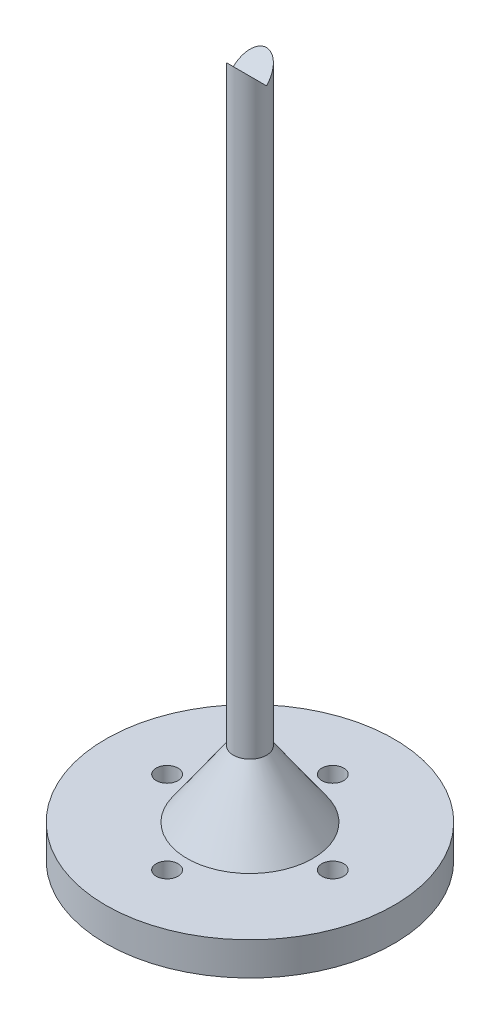
ISO-10303-21;
HEADER;
FILE_DESCRIPTION(('STEP AP214'),'2;1');
FILE_NAME('part.step','',(''),(''),'','','');
FILE_SCHEMA(('AUTOMOTIVE_DESIGN { 1 0 10303 214 1 1 1 1 }'));
ENDSEC;
DATA;
#1=APPLICATION_CONTEXT('core data for automotive mechanical design processes');
#2=APPLICATION_PROTOCOL_DEFINITION('international standard','automotive_design',2000,#1);
#3=PRODUCT_CONTEXT('',#1,'mechanical');
#4=PRODUCT('Part','Part','',(#3));
#5=PRODUCT_RELATED_PRODUCT_CATEGORY('part','',(#4));
#6=PRODUCT_DEFINITION_FORMATION('','',#4);
#7=PRODUCT_DEFINITION_CONTEXT('part definition',#1,'design');
#8=PRODUCT_DEFINITION('design','',#6,#7);
#9=PRODUCT_DEFINITION_SHAPE('','',#8);
#10=(LENGTH_UNIT() NAMED_UNIT(*) SI_UNIT(.MILLI.,.METRE.));
#11=(NAMED_UNIT(*) PLANE_ANGLE_UNIT() SI_UNIT($,.RADIAN.));
#12=(NAMED_UNIT(*) SI_UNIT($,.STERADIAN.) SOLID_ANGLE_UNIT());
#13=UNCERTAINTY_MEASURE_WITH_UNIT(LENGTH_MEASURE(1.E-05),#10,'distance_accuracy_value','');
#14=(GEOMETRIC_REPRESENTATION_CONTEXT(3) GLOBAL_UNCERTAINTY_ASSIGNED_CONTEXT((#13)) GLOBAL_UNIT_ASSIGNED_CONTEXT((#10,
#11,#12)) REPRESENTATION_CONTEXT('',''));
#15=CARTESIAN_POINT('',(0.,0.,0.));
#16=DIRECTION('',(0.,0.,1.));
#17=DIRECTION('',(1.,0.,0.));
#18=AXIS2_PLACEMENT_3D('',#15,#16,#17);
#19=CARTESIAN_POINT('',(0.,210.,0.));
#20=DIRECTION('',(0.,-1.,0.));
#21=DIRECTION('',(0.,0.,-1.));
#22=AXIS2_PLACEMENT_3D('',#19,#20,#21);
#23=CYLINDRICAL_SURFACE('',#22,5.);
#24=CARTESIAN_POINT('',(0.,29.9940720943898,0.));
#25=DIRECTION('',(0.,1.,0.));
#26=DIRECTION('',(0.,0.,1.));
#27=AXIS2_PLACEMENT_3D('',#24,#25,#26);
#28=CIRCLE('',#27,5.);
#29=CARTESIAN_POINT('',(0.,29.9940720943898,-5.));
#30=VERTEX_POINT('',#29);
#31=EDGE_CURVE('E46',#30,#30,#28,.T.);
#32=ORIENTED_EDGE('',*,*,#31,.T.);
#33=EDGE_LOOP('',(#32));
#34=FACE_BOUND('',#33,.T.);
#35=CARTESIAN_POINT('',(0.,205.,0.));
#36=DIRECTION('',(0.,0.707106781186545,-0.70710678118655));
#37=DIRECTION('',(0.,-0.70710678118655,-0.707106781186545));
#38=AXIS2_PLACEMENT_3D('',#35,#36,#37);
#39=ELLIPSE('',#38,7.0710678118655,5.);
#40=CARTESIAN_POINT('',(-5.,205.,0.));
#41=VERTEX_POINT('',#40);
#42=CARTESIAN_POINT('',(5.,205.,0.));
#43=VERTEX_POINT('',#42);
#44=EDGE_CURVE('E57',#41,#43,#39,.T.);
#45=ORIENTED_EDGE('',*,*,#44,.F.);
#46=CARTESIAN_POINT('',(0.,205.,0.));
#47=DIRECTION('',(0.,0.707106781186545,0.70710678118655));
#48=DIRECTION('',(0.,-0.70710678118655,0.707106781186545));
#49=AXIS2_PLACEMENT_3D('',#46,#47,#48);
#50=ELLIPSE('',#49,7.0710678118655,5.);
#51=EDGE_CURVE('E52',#43,#41,#50,.T.);
#52=ORIENTED_EDGE('',*,*,#51,.F.);
#53=EDGE_LOOP('',(#45,#52));
#54=FACE_BOUND('',#53,.T.);
#55=ADVANCED_FACE('F37',(#34,#54),#23,.T.);
#56=CARTESIAN_POINT('',(0.,10.,0.));
#57=DIRECTION('',(0.,-1.,0.));
#58=DIRECTION('',(0.,0.,-1.));
#59=AXIS2_PLACEMENT_3D('',#56,#57,#58);
#60=CYLINDRICAL_SURFACE('',#59,43.5);
#61=CARTESIAN_POINT('',(0.,10.,0.));
#62=DIRECTION('',(0.,1.,0.));
#63=DIRECTION('',(0.,0.,1.));
#64=AXIS2_PLACEMENT_3D('',#61,#62,#63);
#65=CIRCLE('',#64,43.5);
#66=CARTESIAN_POINT('',(0.,10.,43.5));
#67=VERTEX_POINT('',#66);
#68=EDGE_CURVE('E91',#67,#67,#65,.T.);
#69=ORIENTED_EDGE('',*,*,#68,.F.);
#70=EDGE_LOOP('',(#69));
#71=FACE_BOUND('',#70,.T.);
#72=CARTESIAN_POINT('',(0.,0.,0.));
#73=DIRECTION('',(0.,1.,0.));
#74=DIRECTION('',(0.,0.,1.));
#75=AXIS2_PLACEMENT_3D('',#72,#73,#74);
#76=CIRCLE('',#75,43.5);
#77=CARTESIAN_POINT('',(0.,0.,43.5));
#78=VERTEX_POINT('',#77);
#79=EDGE_CURVE('E90',#78,#78,#76,.T.);
#80=ORIENTED_EDGE('',*,*,#79,.T.);
#81=EDGE_LOOP('',(#80));
#82=FACE_BOUND('',#81,.T.);
#83=ADVANCED_FACE('F107',(#71,#82),#60,.T.);
#84=CARTESIAN_POINT('',(0.,10.,0.));
#85=DIRECTION('',(0.,1.,0.));
#86=DIRECTION('',(0.,0.,1.));
#87=AXIS2_PLACEMENT_3D('',#84,#85,#86);
#88=PLANE('',#87);
#89=CARTESIAN_POINT('',(0.,10.,0.));
#90=DIRECTION('',(0.,1.,0.));
#91=DIRECTION('',(0.,0.,1.));
#92=AXIS2_PLACEMENT_3D('',#89,#90,#91);
#93=CIRCLE('',#92,19.);
#94=CARTESIAN_POINT('',(0.,10.,-19.));
#95=VERTEX_POINT('',#94);
#96=EDGE_CURVE('E11',#95,#95,#93,.F.);
#97=ORIENTED_EDGE('',*,*,#96,.T.);
#98=EDGE_LOOP('',(#97));
#99=FACE_BOUND('',#98,.T.);
#100=CARTESIAN_POINT('',(25.,10.,3.48597274212075E-13));
#101=DIRECTION('',(0.,1.,0.));
#102=DIRECTION('',(0.,0.,1.));
#103=AXIS2_PLACEMENT_3D('',#100,#101,#102);
#104=CIRCLE('',#103,3.29999999999999);
#105=CARTESIAN_POINT('',(25.,10.,3.30000000000034));
#106=VERTEX_POINT('',#105);
#107=EDGE_CURVE('E61',#106,#106,#104,.T.);
#108=ORIENTED_EDGE('',*,*,#107,.F.);
#109=EDGE_LOOP('',(#108));
#110=FACE_BOUND('',#109,.T.);
#111=CARTESIAN_POINT('',(0.,10.,-25.));
#112=DIRECTION('',(0.,1.,0.));
#113=DIRECTION('',(0.,0.,1.));
#114=AXIS2_PLACEMENT_3D('',#111,#112,#113);
#115=CIRCLE('',#114,3.29999999999999);
#116=CARTESIAN_POINT('',(0.,10.,-21.7));
#117=VERTEX_POINT('',#116);
#118=EDGE_CURVE('E72',#117,#117,#115,.T.);
#119=ORIENTED_EDGE('',*,*,#118,.F.);
#120=EDGE_LOOP('',(#119));
#121=FACE_BOUND('',#120,.T.);
#122=CARTESIAN_POINT('',(-25.,10.,-1.74023207269919E-13));
#123=DIRECTION('',(0.,1.,0.));
#124=DIRECTION('',(0.,0.,1.));
#125=AXIS2_PLACEMENT_3D('',#122,#123,#124);
#126=CIRCLE('',#125,3.29999999999999);
#127=CARTESIAN_POINT('',(-25.,10.,3.29999999999981));
#128=VERTEX_POINT('',#127);
#129=EDGE_CURVE('E78',#128,#128,#126,.T.);
#130=ORIENTED_EDGE('',*,*,#129,.F.);
#131=EDGE_LOOP('',(#130));
#132=FACE_BOUND('',#131,.T.);
#133=CARTESIAN_POINT('',(0.,10.,25.));
#134=DIRECTION('',(0.,1.,0.));
#135=DIRECTION('',(0.,0.,1.));
#136=AXIS2_PLACEMENT_3D('',#133,#134,#135);
#137=CIRCLE('',#136,3.29999999999999);
#138=CARTESIAN_POINT('',(0.,10.,28.3));
#139=VERTEX_POINT('',#138);
#140=EDGE_CURVE('E84',#139,#139,#137,.T.);
#141=ORIENTED_EDGE('',*,*,#140,.F.);
#142=EDGE_LOOP('',(#141));
#143=FACE_BOUND('',#142,.T.);
#144=ORIENTED_EDGE('',*,*,#68,.T.);
#145=EDGE_LOOP('',(#144));
#146=FACE_BOUND('',#145,.T.);
#147=ADVANCED_FACE('F112',(#99,#110,#121,#132,#143,#146),#88,.T.);
#148=CARTESIAN_POINT('',(0.,0.,0.));
#149=DIRECTION('',(0.,1.,0.));
#150=DIRECTION('',(0.,0.,1.));
#151=AXIS2_PLACEMENT_3D('',#148,#149,#150);
#152=PLANE('',#151);
#153=CARTESIAN_POINT('',(25.,0.,3.48597274212075E-13));
#154=DIRECTION('',(0.,1.,0.));
#155=DIRECTION('',(0.,0.,1.));
#156=AXIS2_PLACEMENT_3D('',#153,#154,#155);
#157=CIRCLE('',#156,3.29999999999999);
#158=CARTESIAN_POINT('',(25.,0.,3.30000000000034));
#159=VERTEX_POINT('',#158);
#160=EDGE_CURVE('E69',#159,#159,#157,.T.);
#161=ORIENTED_EDGE('',*,*,#160,.T.);
#162=EDGE_LOOP('',(#161));
#163=FACE_BOUND('',#162,.T.);
#164=CARTESIAN_POINT('',(0.,0.,-25.));
#165=DIRECTION('',(0.,1.,0.));
#166=DIRECTION('',(0.,0.,1.));
#167=AXIS2_PLACEMENT_3D('',#164,#165,#166);
#168=CIRCLE('',#167,3.29999999999999);
#169=CARTESIAN_POINT('',(0.,0.,-21.7));
#170=VERTEX_POINT('',#169);
#171=EDGE_CURVE('E75',#170,#170,#168,.T.);
#172=ORIENTED_EDGE('',*,*,#171,.T.);
#173=EDGE_LOOP('',(#172));
#174=FACE_BOUND('',#173,.T.);
#175=CARTESIAN_POINT('',(-25.,0.,-1.74023207269919E-13));
#176=DIRECTION('',(0.,1.,0.));
#177=DIRECTION('',(0.,0.,1.));
#178=AXIS2_PLACEMENT_3D('',#175,#176,#177);
#179=CIRCLE('',#178,3.29999999999999);
#180=CARTESIAN_POINT('',(-25.,0.,3.29999999999981));
#181=VERTEX_POINT('',#180);
#182=EDGE_CURVE('E81',#181,#181,#179,.T.);
#183=ORIENTED_EDGE('',*,*,#182,.T.);
#184=EDGE_LOOP('',(#183));
#185=FACE_BOUND('',#184,.T.);
#186=CARTESIAN_POINT('',(0.,0.,25.));
#187=DIRECTION('',(0.,1.,0.));
#188=DIRECTION('',(0.,0.,1.));
#189=AXIS2_PLACEMENT_3D('',#186,#187,#188);
#190=CIRCLE('',#189,3.29999999999999);
#191=CARTESIAN_POINT('',(0.,0.,28.3));
#192=VERTEX_POINT('',#191);
#193=EDGE_CURVE('E87',#192,#192,#190,.T.);
#194=ORIENTED_EDGE('',*,*,#193,.T.);
#195=EDGE_LOOP('',(#194));
#196=FACE_BOUND('',#195,.T.);
#197=ORIENTED_EDGE('',*,*,#79,.F.);
#198=EDGE_LOOP('',(#197));
#199=FACE_BOUND('',#198,.T.);
#200=ADVANCED_FACE('F131',(#163,#174,#185,#196,#199),#152,.F.);
#201=CARTESIAN_POINT('',(0.,10.,25.));
#202=DIRECTION('',(0.,1.,0.));
#203=DIRECTION('',(0.,0.,1.));
#204=AXIS2_PLACEMENT_3D('',#201,#202,#203);
#205=CYLINDRICAL_SURFACE('',#204,3.29999999999999);
#206=ORIENTED_EDGE('',*,*,#193,.F.);
#207=EDGE_LOOP('',(#206));
#208=FACE_BOUND('',#207,.T.);
#209=ORIENTED_EDGE('',*,*,#140,.T.);
#210=EDGE_LOOP('',(#209));
#211=FACE_BOUND('',#210,.T.);
#212=ADVANCED_FACE('F127',(#208,#211),#205,.F.);
#213=CARTESIAN_POINT('',(-25.,10.,-1.74023207269919E-13));
#214=DIRECTION('',(0.,1.,0.));
#215=DIRECTION('',(0.,0.,1.));
#216=AXIS2_PLACEMENT_3D('',#213,#214,#215);
#217=CYLINDRICAL_SURFACE('',#216,3.29999999999999);
#218=ORIENTED_EDGE('',*,*,#182,.F.);
#219=EDGE_LOOP('',(#218));
#220=FACE_BOUND('',#219,.T.);
#221=ORIENTED_EDGE('',*,*,#129,.T.);
#222=EDGE_LOOP('',(#221));
#223=FACE_BOUND('',#222,.T.);
#224=ADVANCED_FACE('F123',(#220,#223),#217,.F.);
#225=CARTESIAN_POINT('',(0.,10.,-25.));
#226=DIRECTION('',(0.,1.,0.));
#227=DIRECTION('',(0.,0.,1.));
#228=AXIS2_PLACEMENT_3D('',#225,#226,#227);
#229=CYLINDRICAL_SURFACE('',#228,3.29999999999999);
#230=ORIENTED_EDGE('',*,*,#171,.F.);
#231=EDGE_LOOP('',(#230));
#232=FACE_BOUND('',#231,.T.);
#233=ORIENTED_EDGE('',*,*,#118,.T.);
#234=EDGE_LOOP('',(#233));
#235=FACE_BOUND('',#234,.T.);
#236=ADVANCED_FACE('F119',(#232,#235),#229,.F.);
#237=CARTESIAN_POINT('',(25.,10.,3.48597274212075E-13));
#238=DIRECTION('',(0.,1.,0.));
#239=DIRECTION('',(0.,0.,1.));
#240=AXIS2_PLACEMENT_3D('',#237,#238,#239);
#241=CYLINDRICAL_SURFACE('',#240,3.29999999999999);
#242=ORIENTED_EDGE('',*,*,#160,.F.);
#243=EDGE_LOOP('',(#242));
#244=FACE_BOUND('',#243,.T.);
#245=ORIENTED_EDGE('',*,*,#107,.T.);
#246=EDGE_LOOP('',(#245));
#247=FACE_BOUND('',#246,.T.);
#248=ADVANCED_FACE('F116',(#244,#247),#241,.F.);
#249=CARTESIAN_POINT('',(10.,205.,0.));
#250=DIRECTION('',(0.,0.707106781186545,-0.70710678118655));
#251=DIRECTION('',(0.,0.70710678118655,0.707106781186545));
#252=AXIS2_PLACEMENT_3D('',#249,#250,#251);
#253=PLANE('',#252);
#254=ORIENTED_EDGE('',*,*,#44,.T.);
#255=DIRECTION('',(-1.,0.,0.));
#256=VECTOR('',#255,1.);
#257=CARTESIAN_POINT('',(10.,205.,0.));
#258=LINE('',#257,#256);
#259=EDGE_CURVE('E59',#43,#41,#258,.T.);
#260=ORIENTED_EDGE('',*,*,#259,.T.);
#261=EDGE_LOOP('',(#254,#260));
#262=FACE_BOUND('',#261,.T.);
#263=ADVANCED_FACE('F58',(#262),#253,.T.);
#264=CARTESIAN_POINT('',(10.,205.,0.));
#265=DIRECTION('',(0.,0.707106781186545,0.70710678118655));
#266=DIRECTION('',(0.,-0.70710678118655,0.707106781186545));
#267=AXIS2_PLACEMENT_3D('',#264,#265,#266);
#268=PLANE('',#267);
#269=ORIENTED_EDGE('',*,*,#51,.T.);
#270=ORIENTED_EDGE('',*,*,#259,.F.);
#271=EDGE_LOOP('',(#269,#270));
#272=FACE_BOUND('',#271,.T.);
#273=ADVANCED_FACE('F63',(#272),#268,.T.);
#274=CARTESIAN_POINT('',(0.,29.9940720943898,0.));
#275=DIRECTION('',(0.,-1.,0.));
#276=DIRECTION('',(0.,0.,-1.));
#277=AXIS2_PLACEMENT_3D('',#274,#275,#276);
#278=CONICAL_SURFACE('',#277,5.,0.610865238198009);
#279=CARTESIAN_POINT('',(0.,10.,-19.));
#280=CARTESIAN_POINT('',(0.,10.2082715843166,-18.8541666666666));
#281=CARTESIAN_POINT('',(0.,10.4165431686331,-18.7083333333333));
#282=CARTESIAN_POINT('',(0.,10.8330863372662,-18.4166666666666));
#283=CARTESIAN_POINT('',(0.,11.0413579215828,-18.2708333333333));
#284=CARTESIAN_POINT('',(0.,11.4579010902159,-17.9791666666666));
#285=CARTESIAN_POINT('',(0.,11.6661726745325,-17.8333333333333));
#286=CARTESIAN_POINT('',(0.,12.0827158431656,-17.5416666666666));
#287=CARTESIAN_POINT('',(0.,12.2909874274822,-17.3958333333333));
#288=CARTESIAN_POINT('',(0.,12.7075305961153,-17.1041666666666));
#289=CARTESIAN_POINT('',(0.,12.9158021804318,-16.9583333333333));
#290=CARTESIAN_POINT('',(0.,13.332345349065,-16.6666666666666));
#291=CARTESIAN_POINT('',(0.,13.5406169333815,-16.5208333333333));
#292=CARTESIAN_POINT('',(0.,13.9571601020147,-16.2291666666666));
#293=CARTESIAN_POINT('',(0.,14.1654316863312,-16.0833333333333));
#294=CARTESIAN_POINT('',(0.,14.5819748549643,-15.7916666666666));
#295=CARTESIAN_POINT('',(0.,14.7902464392809,-15.6458333333333));
#296=CARTESIAN_POINT('',(0.,15.206789607914,-15.3541666666666));
#297=CARTESIAN_POINT('',(0.,15.4150611922306,-15.2083333333333));
#298=CARTESIAN_POINT('',(0.,15.8316043608637,-14.9166666666666));
#299=CARTESIAN_POINT('',(0.,16.0398759451803,-14.7708333333333));
#300=CARTESIAN_POINT('',(0.,16.4564191138134,-14.4791666666666));
#301=CARTESIAN_POINT('',(0.,16.6646906981299,-14.3333333333333));
#302=CARTESIAN_POINT('',(0.,17.0812338667631,-14.0416666666666));
#303=CARTESIAN_POINT('',(0.,17.2895054510796,-13.8958333333333));
#304=CARTESIAN_POINT('',(0.,17.7060486197127,-13.6041666666666));
#305=CARTESIAN_POINT('',(0.,17.9143202040293,-13.4583333333333));
#306=CARTESIAN_POINT('',(0.,18.3308633726624,-13.1666666666666));
#307=CARTESIAN_POINT('',(0.,18.539134956979,-13.0208333333333));
#308=CARTESIAN_POINT('',(0.,18.9556781256121,-12.7291666666666));
#309=CARTESIAN_POINT('',(0.,19.1639497099287,-12.5833333333333));
#310=CARTESIAN_POINT('',(0.,19.5804928785618,-12.2916666666667));
#311=CARTESIAN_POINT('',(0.,19.7887644628783,-12.1458333333333));
#312=CARTESIAN_POINT('',(0.,20.2053076315115,-11.8541666666667));
#313=CARTESIAN_POINT('',(0.,20.413579215828,-11.7083333333333));
#314=CARTESIAN_POINT('',(0.,20.8301223844611,-11.4166666666667));
#315=CARTESIAN_POINT('',(0.,21.0383939687777,-11.2708333333333));
#316=CARTESIAN_POINT('',(0.,21.4549371374108,-10.9791666666667));
#317=CARTESIAN_POINT('',(0.,21.6632087217274,-10.8333333333333));
#318=CARTESIAN_POINT('',(0.,22.0797518903605,-10.5416666666667));
#319=CARTESIAN_POINT('',(0.,22.2880234746771,-10.3958333333333));
#320=CARTESIAN_POINT('',(0.,22.7045666433102,-10.1041666666667));
#321=CARTESIAN_POINT('',(0.,22.9128382276268,-9.95833333333333));
#322=CARTESIAN_POINT('',(0.,23.3293813962599,-9.66666666666666));
#323=CARTESIAN_POINT('',(0.,23.5376529805764,-9.52083333333332));
#324=CARTESIAN_POINT('',(0.,23.9541961492096,-9.22916666666666));
#325=CARTESIAN_POINT('',(0.,24.1624677335261,-9.08333333333333));
#326=CARTESIAN_POINT('',(0.,24.5790109021592,-8.79166666666666));
#327=CARTESIAN_POINT('',(0.,24.7872824864758,-8.64583333333333));
#328=CARTESIAN_POINT('',(0.,25.2038256551089,-8.35416666666666));
#329=CARTESIAN_POINT('',(0.,25.4120972394255,-8.20833333333333));
#330=CARTESIAN_POINT('',(0.,25.8286404080586,-7.91666666666666));
#331=CARTESIAN_POINT('',(0.,26.0369119923752,-7.77083333333333));
#332=CARTESIAN_POINT('',(0.,26.4534551610083,-7.47916666666666));
#333=CARTESIAN_POINT('',(0.,26.6617267453248,-7.33333333333333));
#334=CARTESIAN_POINT('',(0.,27.078269913958,-7.04166666666666));
#335=CARTESIAN_POINT('',(0.,27.2865414982745,-6.89583333333333));
#336=CARTESIAN_POINT('',(0.,27.7030846669076,-6.60416666666667));
#337=CARTESIAN_POINT('',(0.,27.9113562512242,-6.45833333333333));
#338=CARTESIAN_POINT('',(0.,28.3278994198573,-6.16666666666667));
#339=CARTESIAN_POINT('',(0.,28.5361710041739,-6.02083333333333));
#340=CARTESIAN_POINT('',(0.,28.952714172807,-5.72916666666667));
#341=CARTESIAN_POINT('',(0.,29.1609857571236,-5.58333333333333));
#342=CARTESIAN_POINT('',(0.,29.5775289257567,-5.29166666666667));
#343=CARTESIAN_POINT('',(0.,29.7858005100732,-5.14583333333334));
#344=CARTESIAN_POINT('',(0.,29.9940720943898,-5.));
#345=B_SPLINE_CURVE_WITH_KNOTS('',3,(#279,#280,#281,#282,#283,#284,#285,#286,#287,#288,#289,
#290,#291,#292,#293,#294,#295,#296,#297,#298,#299,#300,#301,#302,#303,#304,#305,#306,#307,#308,
#309,#310,#311,#312,#313,#314,#315,#316,#317,#318,#319,#320,#321,#322,#323,#324,#325,#326,#327,
#328,#329,#330,#331,#332,#333,#334,#335,#336,#337,#338,#339,#340,#341,#342,#343,#344),
.UNSPECIFIED.,.F.,.F.,(4,2,2,2,2,2,2,2,2,2,2,2,2,2,2,2,2,2,2,2,2,2,2,2,2,2,2,2,2,2,2,2,4),(0.,
0.762757973084237,1.52551594616847,2.28827391925271,3.05103189233694,3.81378986542118,
4.57654783850541,5.33930581158964,6.10206378467388,6.86482175775811,7.62757973084235,
8.39033770392659,9.15309567701082,9.91585365009506,10.6786116231793,11.4413695962635,
12.2041275693478,12.966885542432,13.7296435155162,14.4924014886005,15.2551594616847,
16.0179174347689,16.7806754078532,17.5434333809374,18.3061913540216,19.0689493271059,
19.8317073001901,20.5944652732743,21.3572232463586,22.1199812194428,22.8827391925271,
23.6454971656113,24.4082551386955),.UNSPECIFIED.);
#346=EDGE_CURVE('BSEAM40',#95,#30,#345,.T.);
#347=ORIENTED_EDGE('',*,*,#96,.F.);
#348=ORIENTED_EDGE('',*,*,#31,.F.);
#349=ORIENTED_EDGE('',*,*,#346,.T.);
#350=ORIENTED_EDGE('',*,*,#346,.F.);
#351=EDGE_LOOP('',(#347,#349,#348,#350));
#352=FACE_BOUND('',#351,.T.);
#353=ADVANCED_FACE('F40',(#352),#278,.T.);
#354=CLOSED_SHELL('',(#55,#83,#147,#200,#212,#224,#236,#248,#263,#273,#353));
#355=MANIFOLD_SOLID_BREP('B2',#354);
#356=ADVANCED_BREP_SHAPE_REPRESENTATION('',(#18,#355),#14);
#357=SHAPE_DEFINITION_REPRESENTATION(#9,#356);
ENDSEC;
END-ISO-10303-21;
